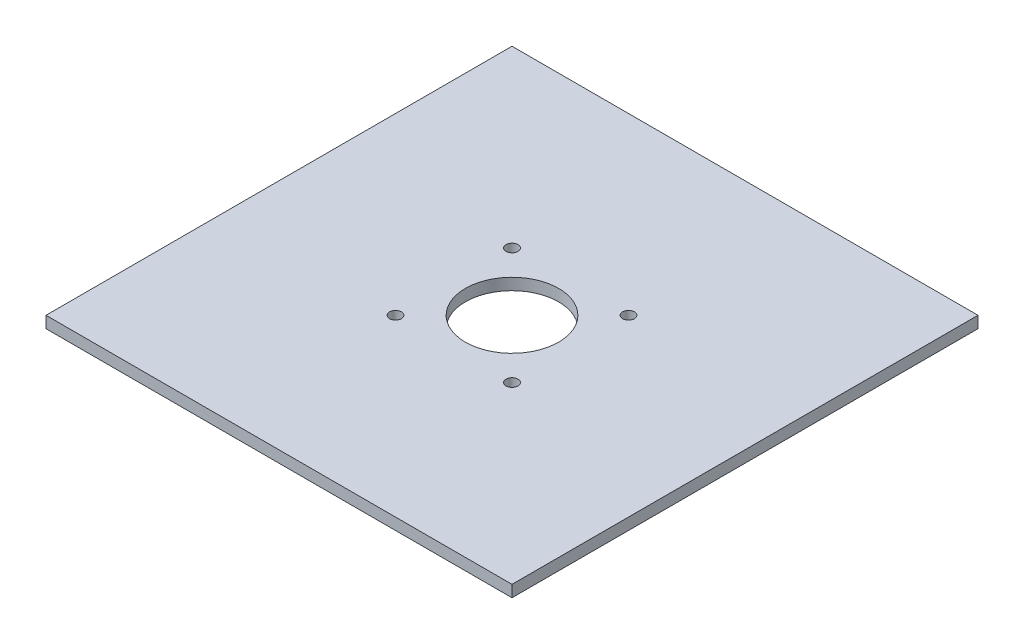
ISO-10303-21;
HEADER;
FILE_DESCRIPTION(('STEP AP214'),'2;1');
FILE_NAME('part.step','',(''),(''),'','','');
FILE_SCHEMA(('AUTOMOTIVE_DESIGN { 1 0 10303 214 1 1 1 1 }'));
ENDSEC;
DATA;
#1=APPLICATION_CONTEXT('core data for automotive mechanical design processes');
#2=APPLICATION_PROTOCOL_DEFINITION('international standard','automotive_design',2000,#1);
#3=PRODUCT_CONTEXT('',#1,'mechanical');
#4=PRODUCT('Part','Part','',(#3));
#5=PRODUCT_RELATED_PRODUCT_CATEGORY('part','',(#4));
#6=PRODUCT_DEFINITION_FORMATION('','',#4);
#7=PRODUCT_DEFINITION_CONTEXT('part definition',#1,'design');
#8=PRODUCT_DEFINITION('design','',#6,#7);
#9=PRODUCT_DEFINITION_SHAPE('','',#8);
#10=(LENGTH_UNIT() NAMED_UNIT(*) SI_UNIT(.MILLI.,.METRE.));
#11=(NAMED_UNIT(*) PLANE_ANGLE_UNIT() SI_UNIT($,.RADIAN.));
#12=(NAMED_UNIT(*) SI_UNIT($,.STERADIAN.) SOLID_ANGLE_UNIT());
#13=UNCERTAINTY_MEASURE_WITH_UNIT(LENGTH_MEASURE(1.E-05),#10,'distance_accuracy_value','');
#14=(GEOMETRIC_REPRESENTATION_CONTEXT(3) GLOBAL_UNCERTAINTY_ASSIGNED_CONTEXT((#13)) GLOBAL_UNIT_ASSIGNED_CONTEXT((#10,
#11,#12)) REPRESENTATION_CONTEXT('',''));
#15=CARTESIAN_POINT('',(0.,0.,0.));
#16=DIRECTION('',(0.,0.,1.));
#17=DIRECTION('',(1.,0.,0.));
#18=AXIS2_PLACEMENT_3D('',#15,#16,#17);
#19=CARTESIAN_POINT('',(0.,5.,0.));
#20=DIRECTION('',(0.,-1.,0.));
#21=DIRECTION('',(0.,0.,-1.));
#22=AXIS2_PLACEMENT_3D('',#19,#20,#21);
#23=PLANE('',#22);
#24=DIRECTION('',(0.,0.,1.));
#25=VECTOR('',#24,1.);
#26=CARTESIAN_POINT('',(-99.9999999999999,5.,-100.));
#27=LINE('',#26,#25);
#28=CARTESIAN_POINT('',(-99.9999999999999,5.,-100.));
#29=VERTEX_POINT('',#28);
#30=CARTESIAN_POINT('',(-99.9999999999999,5.,100.));
#31=VERTEX_POINT('',#30);
#32=EDGE_CURVE('E96',#29,#31,#27,.T.);
#33=ORIENTED_EDGE('',*,*,#32,.T.);
#34=DIRECTION('',(1.,0.,0.));
#35=VECTOR('',#34,1.);
#36=CARTESIAN_POINT('',(99.9999999999999,5.,100.));
#37=LINE('',#36,#35);
#38=CARTESIAN_POINT('',(99.9999999999999,5.,100.));
#39=VERTEX_POINT('',#38);
#40=EDGE_CURVE('E91',#31,#39,#37,.T.);
#41=ORIENTED_EDGE('',*,*,#40,.T.);
#42=DIRECTION('',(0.,0.,-1.));
#43=VECTOR('',#42,1.);
#44=CARTESIAN_POINT('',(99.9999999999999,5.,-100.));
#45=LINE('',#44,#43);
#46=CARTESIAN_POINT('',(99.9999999999999,5.,-100.));
#47=VERTEX_POINT('',#46);
#48=EDGE_CURVE('E94',#39,#47,#45,.T.);
#49=ORIENTED_EDGE('',*,*,#48,.T.);
#50=DIRECTION('',(-1.,0.,0.));
#51=VECTOR('',#50,1.);
#52=CARTESIAN_POINT('',(99.9999999999999,5.,-100.));
#53=LINE('',#52,#51);
#54=EDGE_CURVE('E61',#47,#29,#53,.T.);
#55=ORIENTED_EDGE('',*,*,#54,.T.);
#56=EDGE_LOOP('',(#33,#41,#49,#55));
#57=FACE_BOUND('',#56,.T.);
#58=CARTESIAN_POINT('',(-25.0000013226838,5.,25.0000013226839));
#59=DIRECTION('',(0.,1.,0.));
#60=DIRECTION('',(0.,0.,1.));
#61=AXIS2_PLACEMENT_3D('',#58,#59,#60);
#62=CIRCLE('',#61,2.55);
#63=CARTESIAN_POINT('',(-25.0000013226838,5.,27.5500013226839));
#64=VERTEX_POINT('',#63);
#65=EDGE_CURVE('E116',#64,#64,#62,.T.);
#66=ORIENTED_EDGE('',*,*,#65,.F.);
#67=EDGE_LOOP('',(#66));
#68=FACE_BOUND('',#67,.T.);
#69=CARTESIAN_POINT('',(24.9999986773162,5.,24.9999986773162));
#70=DIRECTION('',(0.,1.,0.));
#71=DIRECTION('',(0.,0.,1.));
#72=AXIS2_PLACEMENT_3D('',#69,#70,#71);
#73=CIRCLE('',#72,2.55);
#74=CARTESIAN_POINT('',(24.9999986773162,5.,27.5499986773162));
#75=VERTEX_POINT('',#74);
#76=EDGE_CURVE('E138',#75,#75,#73,.T.);
#77=ORIENTED_EDGE('',*,*,#76,.F.);
#78=EDGE_LOOP('',(#77));
#79=FACE_BOUND('',#78,.T.);
#80=CARTESIAN_POINT('',(25.0000013226838,5.,-25.0000013226838));
#81=DIRECTION('',(0.,1.,0.));
#82=DIRECTION('',(0.,0.,1.));
#83=AXIS2_PLACEMENT_3D('',#80,#81,#82);
#84=CIRCLE('',#83,2.55);
#85=CARTESIAN_POINT('',(25.0000013226838,5.,-22.4500013226838));
#86=VERTEX_POINT('',#85);
#87=EDGE_CURVE('E146',#86,#86,#84,.T.);
#88=ORIENTED_EDGE('',*,*,#87,.F.);
#89=EDGE_LOOP('',(#88));
#90=FACE_BOUND('',#89,.T.);
#91=CARTESIAN_POINT('',(-24.9999986773161,5.,-24.9999986773161));
#92=DIRECTION('',(0.,1.,0.));
#93=DIRECTION('',(0.,0.,1.));
#94=AXIS2_PLACEMENT_3D('',#91,#92,#93);
#95=CIRCLE('',#94,2.55);
#96=CARTESIAN_POINT('',(-24.9999986773161,5.,-22.4499986773161));
#97=VERTEX_POINT('',#96);
#98=EDGE_CURVE('E154',#97,#97,#95,.T.);
#99=ORIENTED_EDGE('',*,*,#98,.F.);
#100=EDGE_LOOP('',(#99));
#101=FACE_BOUND('',#100,.T.);
#102=CARTESIAN_POINT('',(0.,5.,0.));
#103=DIRECTION('',(0.,1.,0.));
#104=DIRECTION('',(0.,0.,1.));
#105=AXIS2_PLACEMENT_3D('',#102,#103,#104);
#106=CIRCLE('',#105,20.);
#107=CARTESIAN_POINT('',(0.,5.,20.));
#108=VERTEX_POINT('',#107);
#109=EDGE_CURVE('E162',#108,#108,#106,.T.);
#110=ORIENTED_EDGE('',*,*,#109,.F.);
#111=EDGE_LOOP('',(#110));
#112=FACE_BOUND('',#111,.T.);
#113=ADVANCED_FACE('F43',(#57,#68,#79,#90,#101,#112),#23,.F.);
#114=CARTESIAN_POINT('',(0.,0.,0.));
#115=DIRECTION('',(0.,-1.,0.));
#116=DIRECTION('',(0.,0.,-1.));
#117=AXIS2_PLACEMENT_3D('',#114,#115,#116);
#118=PLANE('',#117);
#119=CARTESIAN_POINT('',(-24.9999986773161,0.,-24.9999986773161));
#120=DIRECTION('',(0.,1.,0.));
#121=DIRECTION('',(0.,0.,1.));
#122=AXIS2_PLACEMENT_3D('',#119,#120,#121);
#123=CIRCLE('',#122,2.55);
#124=CARTESIAN_POINT('',(-24.9999986773161,0.,-22.4499986773161));
#125=VERTEX_POINT('',#124);
#126=EDGE_CURVE('E158',#125,#125,#123,.T.);
#127=ORIENTED_EDGE('',*,*,#126,.T.);
#128=EDGE_LOOP('',(#127));
#129=FACE_BOUND('',#128,.T.);
#130=CARTESIAN_POINT('',(24.9999986773162,0.,24.9999986773162));
#131=DIRECTION('',(0.,1.,0.));
#132=DIRECTION('',(0.,0.,1.));
#133=AXIS2_PLACEMENT_3D('',#130,#131,#132);
#134=CIRCLE('',#133,2.55);
#135=CARTESIAN_POINT('',(24.9999986773162,0.,27.5499986773162));
#136=VERTEX_POINT('',#135);
#137=EDGE_CURVE('E142',#136,#136,#134,.T.);
#138=ORIENTED_EDGE('',*,*,#137,.T.);
#139=EDGE_LOOP('',(#138));
#140=FACE_BOUND('',#139,.T.);
#141=DIRECTION('',(0.,0.,1.));
#142=VECTOR('',#141,1.);
#143=CARTESIAN_POINT('',(-99.9999999999999,0.,-100.));
#144=LINE('',#143,#142);
#145=CARTESIAN_POINT('',(-99.9999999999999,0.,-100.));
#146=VERTEX_POINT('',#145);
#147=CARTESIAN_POINT('',(-99.9999999999999,0.,100.));
#148=VERTEX_POINT('',#147);
#149=EDGE_CURVE('E112',#146,#148,#144,.T.);
#150=ORIENTED_EDGE('',*,*,#149,.F.);
#151=DIRECTION('',(-1.,0.,0.));
#152=VECTOR('',#151,1.);
#153=CARTESIAN_POINT('',(99.9999999999999,0.,-100.));
#154=LINE('',#153,#152);
#155=CARTESIAN_POINT('',(99.9999999999999,0.,-100.));
#156=VERTEX_POINT('',#155);
#157=EDGE_CURVE('E84',#156,#146,#154,.T.);
#158=ORIENTED_EDGE('',*,*,#157,.F.);
#159=DIRECTION('',(0.,0.,-1.));
#160=VECTOR('',#159,1.);
#161=CARTESIAN_POINT('',(99.9999999999999,0.,-100.));
#162=LINE('',#161,#160);
#163=CARTESIAN_POINT('',(99.9999999999999,0.,100.));
#164=VERTEX_POINT('',#163);
#165=EDGE_CURVE('E78',#164,#156,#162,.T.);
#166=ORIENTED_EDGE('',*,*,#165,.F.);
#167=DIRECTION('',(1.,0.,0.));
#168=VECTOR('',#167,1.);
#169=CARTESIAN_POINT('',(99.9999999999999,0.,100.));
#170=LINE('',#169,#168);
#171=EDGE_CURVE('E101',#148,#164,#170,.T.);
#172=ORIENTED_EDGE('',*,*,#171,.F.);
#173=EDGE_LOOP('',(#150,#158,#166,#172));
#174=FACE_BOUND('',#173,.T.);
#175=CARTESIAN_POINT('',(-25.0000013226838,0.,25.0000013226839));
#176=DIRECTION('',(0.,1.,0.));
#177=DIRECTION('',(0.,0.,1.));
#178=AXIS2_PLACEMENT_3D('',#175,#176,#177);
#179=CIRCLE('',#178,2.55);
#180=CARTESIAN_POINT('',(-25.0000013226838,0.,27.5500013226839));
#181=VERTEX_POINT('',#180);
#182=EDGE_CURVE('E134',#181,#181,#179,.T.);
#183=ORIENTED_EDGE('',*,*,#182,.T.);
#184=EDGE_LOOP('',(#183));
#185=FACE_BOUND('',#184,.T.);
#186=CARTESIAN_POINT('',(25.0000013226838,0.,-25.0000013226838));
#187=DIRECTION('',(0.,1.,0.));
#188=DIRECTION('',(0.,0.,1.));
#189=AXIS2_PLACEMENT_3D('',#186,#187,#188);
#190=CIRCLE('',#189,2.55);
#191=CARTESIAN_POINT('',(25.0000013226838,0.,-22.4500013226838));
#192=VERTEX_POINT('',#191);
#193=EDGE_CURVE('E150',#192,#192,#190,.T.);
#194=ORIENTED_EDGE('',*,*,#193,.T.);
#195=EDGE_LOOP('',(#194));
#196=FACE_BOUND('',#195,.T.);
#197=CARTESIAN_POINT('',(0.,0.,0.));
#198=DIRECTION('',(0.,1.,0.));
#199=DIRECTION('',(0.,0.,1.));
#200=AXIS2_PLACEMENT_3D('',#197,#198,#199);
#201=CIRCLE('',#200,20.);
#202=CARTESIAN_POINT('',(0.,0.,20.));
#203=VERTEX_POINT('',#202);
#204=EDGE_CURVE('E166',#203,#203,#201,.T.);
#205=ORIENTED_EDGE('',*,*,#204,.T.);
#206=EDGE_LOOP('',(#205));
#207=FACE_BOUND('',#206,.T.);
#208=ADVANCED_FACE('F129',(#129,#140,#174,#185,#196,#207),#118,.T.);
#209=CARTESIAN_POINT('',(-99.9999999999999,5.,-100.));
#210=DIRECTION('',(1.,0.,0.));
#211=DIRECTION('',(0.,0.,-1.));
#212=AXIS2_PLACEMENT_3D('',#209,#210,#211);
#213=PLANE('',#212);
#214=ORIENTED_EDGE('',*,*,#149,.T.);
#215=DIRECTION('',(0.,-1.,0.));
#216=VECTOR('',#215,1.);
#217=CARTESIAN_POINT('',(-99.9999999999999,5.,100.));
#218=LINE('',#217,#216);
#219=EDGE_CURVE('E11',#31,#148,#218,.T.);
#220=ORIENTED_EDGE('',*,*,#219,.F.);
#221=ORIENTED_EDGE('',*,*,#32,.F.);
#222=DIRECTION('',(0.,-1.,0.));
#223=VECTOR('',#222,1.);
#224=CARTESIAN_POINT('',(-99.9999999999999,5.,-100.));
#225=LINE('',#224,#223);
#226=EDGE_CURVE('E108',#29,#146,#225,.T.);
#227=ORIENTED_EDGE('',*,*,#226,.T.);
#228=EDGE_LOOP('',(#214,#220,#221,#227));
#229=FACE_BOUND('',#228,.T.);
#230=ADVANCED_FACE('F45',(#229),#213,.F.);
#231=CARTESIAN_POINT('',(99.9999999999999,5.,100.));
#232=DIRECTION('',(0.,0.,-1.));
#233=DIRECTION('',(-1.,0.,0.));
#234=AXIS2_PLACEMENT_3D('',#231,#232,#233);
#235=PLANE('',#234);
#236=ORIENTED_EDGE('',*,*,#171,.T.);
#237=DIRECTION('',(0.,-1.,0.));
#238=VECTOR('',#237,1.);
#239=CARTESIAN_POINT('',(99.9999999999999,5.,100.));
#240=LINE('',#239,#238);
#241=EDGE_CURVE('E53',#39,#164,#240,.T.);
#242=ORIENTED_EDGE('',*,*,#241,.F.);
#243=ORIENTED_EDGE('',*,*,#40,.F.);
#244=ORIENTED_EDGE('',*,*,#219,.T.);
#245=EDGE_LOOP('',(#236,#242,#243,#244));
#246=FACE_BOUND('',#245,.T.);
#247=ADVANCED_FACE('F100',(#246),#235,.F.);
#248=CARTESIAN_POINT('',(99.9999999999999,5.,-100.));
#249=DIRECTION('',(-1.,0.,0.));
#250=DIRECTION('',(0.,0.,1.));
#251=AXIS2_PLACEMENT_3D('',#248,#249,#250);
#252=PLANE('',#251);
#253=ORIENTED_EDGE('',*,*,#165,.T.);
#254=DIRECTION('',(0.,-1.,0.));
#255=VECTOR('',#254,1.);
#256=CARTESIAN_POINT('',(99.9999999999999,5.,-100.));
#257=LINE('',#256,#255);
#258=EDGE_CURVE('E103',#47,#156,#257,.T.);
#259=ORIENTED_EDGE('',*,*,#258,.F.);
#260=ORIENTED_EDGE('',*,*,#48,.F.);
#261=ORIENTED_EDGE('',*,*,#241,.T.);
#262=EDGE_LOOP('',(#253,#259,#260,#261));
#263=FACE_BOUND('',#262,.T.);
#264=ADVANCED_FACE('F104',(#263),#252,.F.);
#265=CARTESIAN_POINT('',(99.9999999999999,5.,-100.));
#266=DIRECTION('',(0.,0.,1.));
#267=DIRECTION('',(1.,0.,0.));
#268=AXIS2_PLACEMENT_3D('',#265,#266,#267);
#269=PLANE('',#268);
#270=ORIENTED_EDGE('',*,*,#157,.T.);
#271=ORIENTED_EDGE('',*,*,#226,.F.);
#272=ORIENTED_EDGE('',*,*,#54,.F.);
#273=ORIENTED_EDGE('',*,*,#258,.T.);
#274=EDGE_LOOP('',(#270,#271,#272,#273));
#275=FACE_BOUND('',#274,.T.);
#276=ADVANCED_FACE('F126',(#275),#269,.F.);
#277=CARTESIAN_POINT('',(-25.0000013226838,5.,25.0000013226839));
#278=DIRECTION('',(0.,-1.,0.));
#279=DIRECTION('',(0.,0.,-1.));
#280=AXIS2_PLACEMENT_3D('',#277,#278,#279);
#281=CYLINDRICAL_SURFACE('',#280,2.55);
#282=ORIENTED_EDGE('',*,*,#65,.T.);
#283=EDGE_LOOP('',(#282));
#284=FACE_BOUND('',#283,.T.);
#285=ORIENTED_EDGE('',*,*,#182,.F.);
#286=EDGE_LOOP('',(#285));
#287=FACE_BOUND('',#286,.T.);
#288=ADVANCED_FACE('F185',(#284,#287),#281,.F.);
#289=CARTESIAN_POINT('',(24.9999986773162,5.,24.9999986773162));
#290=DIRECTION('',(0.,-1.,0.));
#291=DIRECTION('',(0.,0.,-1.));
#292=AXIS2_PLACEMENT_3D('',#289,#290,#291);
#293=CYLINDRICAL_SURFACE('',#292,2.55);
#294=ORIENTED_EDGE('',*,*,#76,.T.);
#295=EDGE_LOOP('',(#294));
#296=FACE_BOUND('',#295,.T.);
#297=ORIENTED_EDGE('',*,*,#137,.F.);
#298=EDGE_LOOP('',(#297));
#299=FACE_BOUND('',#298,.T.);
#300=ADVANCED_FACE('F239',(#296,#299),#293,.F.);
#301=CARTESIAN_POINT('',(25.0000013226838,5.,-25.0000013226838));
#302=DIRECTION('',(0.,-1.,0.));
#303=DIRECTION('',(0.,0.,-1.));
#304=AXIS2_PLACEMENT_3D('',#301,#302,#303);
#305=CYLINDRICAL_SURFACE('',#304,2.55);
#306=ORIENTED_EDGE('',*,*,#87,.T.);
#307=EDGE_LOOP('',(#306));
#308=FACE_BOUND('',#307,.T.);
#309=ORIENTED_EDGE('',*,*,#193,.F.);
#310=EDGE_LOOP('',(#309));
#311=FACE_BOUND('',#310,.T.);
#312=ADVANCED_FACE('F248',(#308,#311),#305,.F.);
#313=CARTESIAN_POINT('',(-24.9999986773161,5.,-24.9999986773161));
#314=DIRECTION('',(0.,-1.,0.));
#315=DIRECTION('',(0.,0.,-1.));
#316=AXIS2_PLACEMENT_3D('',#313,#314,#315);
#317=CYLINDRICAL_SURFACE('',#316,2.55);
#318=ORIENTED_EDGE('',*,*,#98,.T.);
#319=EDGE_LOOP('',(#318));
#320=FACE_BOUND('',#319,.T.);
#321=ORIENTED_EDGE('',*,*,#126,.F.);
#322=EDGE_LOOP('',(#321));
#323=FACE_BOUND('',#322,.T.);
#324=ADVANCED_FACE('F257',(#320,#323),#317,.F.);
#325=CARTESIAN_POINT('',(0.,5.,0.));
#326=DIRECTION('',(0.,-1.,0.));
#327=DIRECTION('',(0.,0.,-1.));
#328=AXIS2_PLACEMENT_3D('',#325,#326,#327);
#329=CYLINDRICAL_SURFACE('',#328,20.);
#330=ORIENTED_EDGE('',*,*,#109,.T.);
#331=EDGE_LOOP('',(#330));
#332=FACE_BOUND('',#331,.T.);
#333=ORIENTED_EDGE('',*,*,#204,.F.);
#334=EDGE_LOOP('',(#333));
#335=FACE_BOUND('',#334,.T.);
#336=ADVANCED_FACE('F174',(#332,#335),#329,.F.);
#337=CLOSED_SHELL('',(#113,#208,#230,#247,#264,#276,#288,#300,#312,#324,#336));
#338=MANIFOLD_SOLID_BREP('B2',#337);
#339=ADVANCED_BREP_SHAPE_REPRESENTATION('',(#18,#338),#14);
#340=SHAPE_DEFINITION_REPRESENTATION(#9,#339);
ENDSEC;
END-ISO-10303-21;
